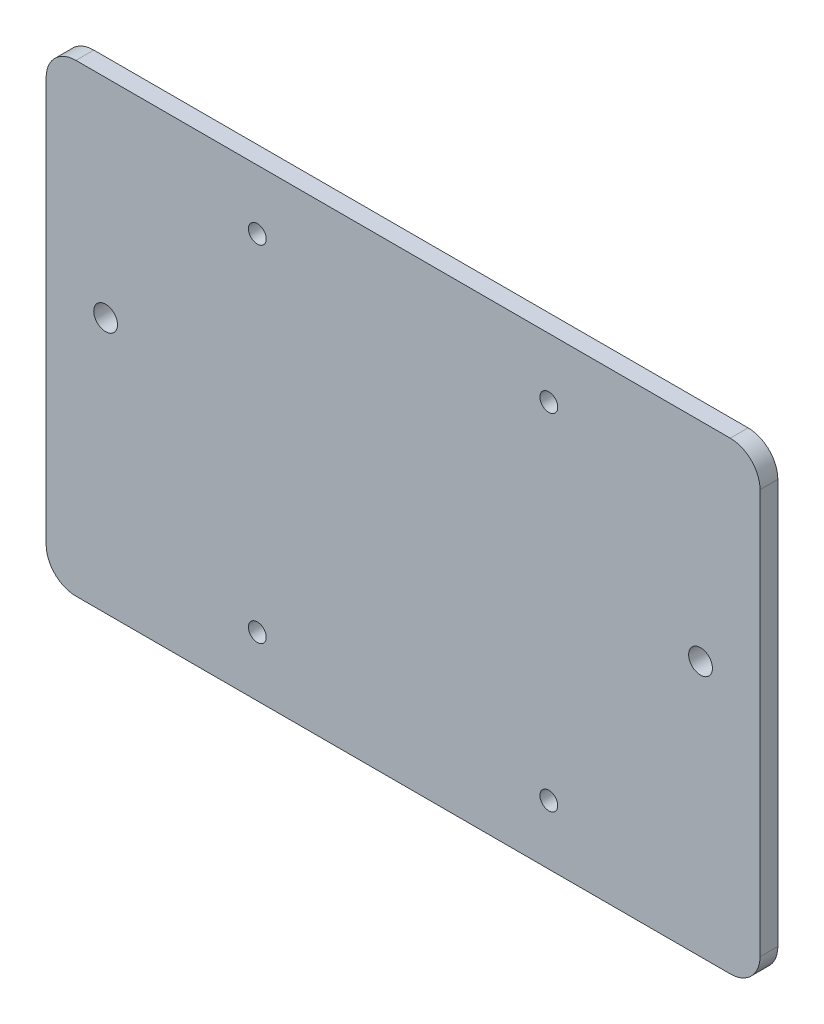
ISO-10303-21;
HEADER;
FILE_DESCRIPTION(('STEP AP214'),'2;1');
FILE_NAME('part.step','',(''),(''),'','','');
FILE_SCHEMA(('AUTOMOTIVE_DESIGN { 1 0 10303 214 1 1 1 1 }'));
ENDSEC;
DATA;
#1=APPLICATION_CONTEXT('core data for automotive mechanical design processes');
#2=APPLICATION_PROTOCOL_DEFINITION('international standard','automotive_design',2000,#1);
#3=PRODUCT_CONTEXT('',#1,'mechanical');
#4=PRODUCT('Part','Part','',(#3));
#5=PRODUCT_RELATED_PRODUCT_CATEGORY('part','',(#4));
#6=PRODUCT_DEFINITION_FORMATION('','',#4);
#7=PRODUCT_DEFINITION_CONTEXT('part definition',#1,'design');
#8=PRODUCT_DEFINITION('design','',#6,#7);
#9=PRODUCT_DEFINITION_SHAPE('','',#8);
#10=(LENGTH_UNIT() NAMED_UNIT(*) SI_UNIT(.MILLI.,.METRE.));
#11=(NAMED_UNIT(*) PLANE_ANGLE_UNIT() SI_UNIT($,.RADIAN.));
#12=(NAMED_UNIT(*) SI_UNIT($,.STERADIAN.) SOLID_ANGLE_UNIT());
#13=UNCERTAINTY_MEASURE_WITH_UNIT(LENGTH_MEASURE(1.E-05),#10,'distance_accuracy_value','');
#14=(GEOMETRIC_REPRESENTATION_CONTEXT(3) GLOBAL_UNCERTAINTY_ASSIGNED_CONTEXT((#13)) GLOBAL_UNIT_ASSIGNED_CONTEXT((#10,
#11,#12)) REPRESENTATION_CONTEXT('',''));
#15=CARTESIAN_POINT('',(0.,0.,0.));
#16=DIRECTION('',(0.,0.,1.));
#17=DIRECTION('',(1.,0.,0.));
#18=AXIS2_PLACEMENT_3D('',#15,#16,#17);
#19=CARTESIAN_POINT('',(55.,34.,3.));
#20=DIRECTION('',(0.,0.,-1.));
#21=DIRECTION('',(-1.,0.,0.));
#22=AXIS2_PLACEMENT_3D('',#19,#20,#21);
#23=PLANE('',#22);
#24=CARTESIAN_POINT('',(55.,34.,3.));
#25=DIRECTION('',(0.,0.,1.));
#26=DIRECTION('',(-1.,0.,0.));
#27=AXIS2_PLACEMENT_3D('',#24,#25,#26);
#28=CIRCLE('',#27,5.);
#29=CARTESIAN_POINT('',(60.,34.,3.));
#30=VERTEX_POINT('',#29);
#31=CARTESIAN_POINT('',(55.,39.,3.));
#32=VERTEX_POINT('',#31);
#33=EDGE_CURVE('E145',#30,#32,#28,.T.);
#34=ORIENTED_EDGE('',*,*,#33,.T.);
#35=DIRECTION('',(-1.,0.,0.));
#36=VECTOR('',#35,1.);
#37=CARTESIAN_POINT('',(-55.,39.,3.));
#38=LINE('',#37,#36);
#39=CARTESIAN_POINT('',(-55.,39.,3.));
#40=VERTEX_POINT('',#39);
#41=EDGE_CURVE('E93',#32,#40,#38,.T.);
#42=ORIENTED_EDGE('',*,*,#41,.T.);
#43=CARTESIAN_POINT('',(-55.,34.,3.));
#44=DIRECTION('',(0.,0.,1.));
#45=DIRECTION('',(1.,0.,0.));
#46=AXIS2_PLACEMENT_3D('',#43,#44,#45);
#47=CIRCLE('',#46,5.);
#48=CARTESIAN_POINT('',(-60.,34.,3.));
#49=VERTEX_POINT('',#48);
#50=EDGE_CURVE('E160',#40,#49,#47,.T.);
#51=ORIENTED_EDGE('',*,*,#50,.T.);
#52=DIRECTION('',(0.,-1.,0.));
#53=VECTOR('',#52,1.);
#54=CARTESIAN_POINT('',(-60.,34.,3.));
#55=LINE('',#54,#53);
#56=CARTESIAN_POINT('',(-60.,-34.,3.));
#57=VERTEX_POINT('',#56);
#58=EDGE_CURVE('E173',#49,#57,#55,.T.);
#59=ORIENTED_EDGE('',*,*,#58,.T.);
#60=CARTESIAN_POINT('',(-55.,-34.,3.));
#61=DIRECTION('',(0.,0.,1.));
#62=DIRECTION('',(1.,0.,0.));
#63=AXIS2_PLACEMENT_3D('',#60,#61,#62);
#64=CIRCLE('',#63,5.);
#65=CARTESIAN_POINT('',(-55.,-39.,3.));
#66=VERTEX_POINT('',#65);
#67=EDGE_CURVE('E112',#57,#66,#64,.T.);
#68=ORIENTED_EDGE('',*,*,#67,.T.);
#69=DIRECTION('',(1.,0.,0.));
#70=VECTOR('',#69,1.);
#71=CARTESIAN_POINT('',(-55.,-39.,3.));
#72=LINE('',#71,#70);
#73=CARTESIAN_POINT('',(55.,-39.,3.));
#74=VERTEX_POINT('',#73);
#75=EDGE_CURVE('E106',#66,#74,#72,.T.);
#76=ORIENTED_EDGE('',*,*,#75,.T.);
#77=CARTESIAN_POINT('',(55.,-34.,3.));
#78=DIRECTION('',(0.,0.,1.));
#79=DIRECTION('',(1.,0.,0.));
#80=AXIS2_PLACEMENT_3D('',#77,#78,#79);
#81=CIRCLE('',#80,5.);
#82=CARTESIAN_POINT('',(60.,-34.,3.));
#83=VERTEX_POINT('',#82);
#84=EDGE_CURVE('E110',#74,#83,#81,.T.);
#85=ORIENTED_EDGE('',*,*,#84,.T.);
#86=DIRECTION('',(0.,1.,0.));
#87=VECTOR('',#86,1.);
#88=CARTESIAN_POINT('',(60.,34.,3.));
#89=LINE('',#88,#87);
#90=EDGE_CURVE('E50',#83,#30,#89,.T.);
#91=ORIENTED_EDGE('',*,*,#90,.T.);
#92=EDGE_LOOP('',(#34,#42,#51,#59,#68,#76,#85,#91));
#93=FACE_BOUND('',#92,.T.);
#94=CARTESIAN_POINT('',(-24.5,29.,3.));
#95=DIRECTION('',(0.,0.,1.));
#96=DIRECTION('',(1.,0.,0.));
#97=AXIS2_PLACEMENT_3D('',#94,#95,#96);
#98=CIRCLE('',#97,1.5);
#99=CARTESIAN_POINT('',(-23.,29.,3.));
#100=VERTEX_POINT('',#99);
#101=EDGE_CURVE('E134',#100,#100,#98,.T.);
#102=ORIENTED_EDGE('',*,*,#101,.F.);
#103=EDGE_LOOP('',(#102));
#104=FACE_BOUND('',#103,.T.);
#105=CARTESIAN_POINT('',(24.5,29.,3.));
#106=DIRECTION('',(0.,0.,1.));
#107=DIRECTION('',(1.,0.,0.));
#108=AXIS2_PLACEMENT_3D('',#105,#106,#107);
#109=CIRCLE('',#108,1.5);
#110=CARTESIAN_POINT('',(26.,29.,3.));
#111=VERTEX_POINT('',#110);
#112=EDGE_CURVE('E182',#111,#111,#109,.T.);
#113=ORIENTED_EDGE('',*,*,#112,.F.);
#114=EDGE_LOOP('',(#113));
#115=FACE_BOUND('',#114,.T.);
#116=CARTESIAN_POINT('',(-24.5,-29.,3.));
#117=DIRECTION('',(0.,0.,1.));
#118=DIRECTION('',(1.,0.,0.));
#119=AXIS2_PLACEMENT_3D('',#116,#117,#118);
#120=CIRCLE('',#119,1.5);
#121=CARTESIAN_POINT('',(-23.,-29.,3.));
#122=VERTEX_POINT('',#121);
#123=EDGE_CURVE('E188',#122,#122,#120,.T.);
#124=ORIENTED_EDGE('',*,*,#123,.F.);
#125=EDGE_LOOP('',(#124));
#126=FACE_BOUND('',#125,.T.);
#127=CARTESIAN_POINT('',(24.5,-29.,3.));
#128=DIRECTION('',(0.,0.,1.));
#129=DIRECTION('',(1.,0.,0.));
#130=AXIS2_PLACEMENT_3D('',#127,#128,#129);
#131=CIRCLE('',#130,1.5);
#132=CARTESIAN_POINT('',(26.,-29.,3.));
#133=VERTEX_POINT('',#132);
#134=EDGE_CURVE('E194',#133,#133,#131,.T.);
#135=ORIENTED_EDGE('',*,*,#134,.F.);
#136=EDGE_LOOP('',(#135));
#137=FACE_BOUND('',#136,.T.);
#138=CARTESIAN_POINT('',(50.,4.00000000000002,3.));
#139=DIRECTION('',(0.,0.,1.));
#140=DIRECTION('',(1.,0.,0.));
#141=AXIS2_PLACEMENT_3D('',#138,#139,#140);
#142=CIRCLE('',#141,2.);
#143=CARTESIAN_POINT('',(52.,4.00000000000002,3.));
#144=VERTEX_POINT('',#143);
#145=EDGE_CURVE('E200',#144,#144,#142,.T.);
#146=ORIENTED_EDGE('',*,*,#145,.F.);
#147=EDGE_LOOP('',(#146));
#148=FACE_BOUND('',#147,.T.);
#149=CARTESIAN_POINT('',(-50.,4.,3.));
#150=DIRECTION('',(0.,0.,1.));
#151=DIRECTION('',(-1.,0.,0.));
#152=AXIS2_PLACEMENT_3D('',#149,#150,#151);
#153=CIRCLE('',#152,2.);
#154=CARTESIAN_POINT('',(-52.,4.,3.));
#155=VERTEX_POINT('',#154);
#156=EDGE_CURVE('E206',#155,#155,#153,.T.);
#157=ORIENTED_EDGE('',*,*,#156,.F.);
#158=EDGE_LOOP('',(#157));
#159=FACE_BOUND('',#158,.T.);
#160=ADVANCED_FACE('F33',(#93,#104,#115,#126,#137,#148,#159),#23,.F.);
#161=CARTESIAN_POINT('',(55.,34.,0.));
#162=DIRECTION('',(0.,0.,-1.));
#163=DIRECTION('',(-1.,0.,0.));
#164=AXIS2_PLACEMENT_3D('',#161,#162,#163);
#165=PLANE('',#164);
#166=CARTESIAN_POINT('',(50.,4.00000000000002,0.));
#167=DIRECTION('',(0.,0.,1.));
#168=DIRECTION('',(1.,0.,0.));
#169=AXIS2_PLACEMENT_3D('',#166,#167,#168);
#170=CIRCLE('',#169,2.);
#171=CARTESIAN_POINT('',(52.,4.00000000000002,0.));
#172=VERTEX_POINT('',#171);
#173=EDGE_CURVE('E203',#172,#172,#170,.T.);
#174=ORIENTED_EDGE('',*,*,#173,.T.);
#175=EDGE_LOOP('',(#174));
#176=FACE_BOUND('',#175,.T.);
#177=CARTESIAN_POINT('',(-24.5,-29.,0.));
#178=DIRECTION('',(0.,0.,1.));
#179=DIRECTION('',(1.,0.,0.));
#180=AXIS2_PLACEMENT_3D('',#177,#178,#179);
#181=CIRCLE('',#180,1.5);
#182=CARTESIAN_POINT('',(-23.,-29.,0.));
#183=VERTEX_POINT('',#182);
#184=EDGE_CURVE('E191',#183,#183,#181,.T.);
#185=ORIENTED_EDGE('',*,*,#184,.T.);
#186=EDGE_LOOP('',(#185));
#187=FACE_BOUND('',#186,.T.);
#188=CARTESIAN_POINT('',(-24.5,29.,0.));
#189=DIRECTION('',(0.,0.,1.));
#190=DIRECTION('',(1.,0.,0.));
#191=AXIS2_PLACEMENT_3D('',#188,#189,#190);
#192=CIRCLE('',#191,1.5);
#193=CARTESIAN_POINT('',(-23.,29.,0.));
#194=VERTEX_POINT('',#193);
#195=EDGE_CURVE('E179',#194,#194,#192,.T.);
#196=ORIENTED_EDGE('',*,*,#195,.T.);
#197=EDGE_LOOP('',(#196));
#198=FACE_BOUND('',#197,.T.);
#199=CARTESIAN_POINT('',(55.,34.,0.));
#200=DIRECTION('',(0.,0.,1.));
#201=DIRECTION('',(-1.,0.,0.));
#202=AXIS2_PLACEMENT_3D('',#199,#200,#201);
#203=CIRCLE('',#202,5.);
#204=CARTESIAN_POINT('',(60.,34.,0.));
#205=VERTEX_POINT('',#204);
#206=CARTESIAN_POINT('',(55.,39.,0.));
#207=VERTEX_POINT('',#206);
#208=EDGE_CURVE('E130',#205,#207,#203,.T.);
#209=ORIENTED_EDGE('',*,*,#208,.F.);
#210=DIRECTION('',(0.,1.,0.));
#211=VECTOR('',#210,1.);
#212=CARTESIAN_POINT('',(60.,34.,0.));
#213=LINE('',#212,#211);
#214=CARTESIAN_POINT('',(60.,-34.,0.));
#215=VERTEX_POINT('',#214);
#216=EDGE_CURVE('E85',#215,#205,#213,.T.);
#217=ORIENTED_EDGE('',*,*,#216,.F.);
#218=CARTESIAN_POINT('',(55.,-34.,0.));
#219=DIRECTION('',(0.,0.,1.));
#220=DIRECTION('',(1.,0.,0.));
#221=AXIS2_PLACEMENT_3D('',#218,#219,#220);
#222=CIRCLE('',#221,5.);
#223=CARTESIAN_POINT('',(55.,-39.,0.));
#224=VERTEX_POINT('',#223);
#225=EDGE_CURVE('E79',#224,#215,#222,.T.);
#226=ORIENTED_EDGE('',*,*,#225,.F.);
#227=DIRECTION('',(1.,0.,0.));
#228=VECTOR('',#227,1.);
#229=CARTESIAN_POINT('',(-55.,-39.,0.));
#230=LINE('',#229,#228);
#231=CARTESIAN_POINT('',(-55.,-39.,0.));
#232=VERTEX_POINT('',#231);
#233=EDGE_CURVE('E120',#232,#224,#230,.T.);
#234=ORIENTED_EDGE('',*,*,#233,.F.);
#235=CARTESIAN_POINT('',(-55.,-34.,0.));
#236=DIRECTION('',(0.,0.,1.));
#237=DIRECTION('',(1.,0.,0.));
#238=AXIS2_PLACEMENT_3D('',#235,#236,#237);
#239=CIRCLE('',#238,5.);
#240=CARTESIAN_POINT('',(-60.,-34.,0.));
#241=VERTEX_POINT('',#240);
#242=EDGE_CURVE('E140',#241,#232,#239,.T.);
#243=ORIENTED_EDGE('',*,*,#242,.F.);
#244=DIRECTION('',(0.,-1.,0.));
#245=VECTOR('',#244,1.);
#246=CARTESIAN_POINT('',(-60.,34.,0.));
#247=LINE('',#246,#245);
#248=CARTESIAN_POINT('',(-60.,34.,0.));
#249=VERTEX_POINT('',#248);
#250=EDGE_CURVE('E138',#249,#241,#247,.T.);
#251=ORIENTED_EDGE('',*,*,#250,.F.);
#252=CARTESIAN_POINT('',(-55.,34.,0.));
#253=DIRECTION('',(0.,0.,1.));
#254=DIRECTION('',(1.,0.,0.));
#255=AXIS2_PLACEMENT_3D('',#252,#253,#254);
#256=CIRCLE('',#255,5.);
#257=CARTESIAN_POINT('',(-55.,39.,0.));
#258=VERTEX_POINT('',#257);
#259=EDGE_CURVE('E136',#258,#249,#256,.T.);
#260=ORIENTED_EDGE('',*,*,#259,.F.);
#261=DIRECTION('',(-1.,0.,0.));
#262=VECTOR('',#261,1.);
#263=CARTESIAN_POINT('',(-55.,39.,0.));
#264=LINE('',#263,#262);
#265=EDGE_CURVE('E133',#207,#258,#264,.T.);
#266=ORIENTED_EDGE('',*,*,#265,.F.);
#267=EDGE_LOOP('',(#209,#217,#226,#234,#243,#251,#260,#266));
#268=FACE_BOUND('',#267,.T.);
#269=CARTESIAN_POINT('',(24.5,29.,0.));
#270=DIRECTION('',(0.,0.,1.));
#271=DIRECTION('',(1.,0.,0.));
#272=AXIS2_PLACEMENT_3D('',#269,#270,#271);
#273=CIRCLE('',#272,1.5);
#274=CARTESIAN_POINT('',(26.,29.,0.));
#275=VERTEX_POINT('',#274);
#276=EDGE_CURVE('E185',#275,#275,#273,.T.);
#277=ORIENTED_EDGE('',*,*,#276,.T.);
#278=EDGE_LOOP('',(#277));
#279=FACE_BOUND('',#278,.T.);
#280=CARTESIAN_POINT('',(24.5,-29.,0.));
#281=DIRECTION('',(0.,0.,1.));
#282=DIRECTION('',(1.,0.,0.));
#283=AXIS2_PLACEMENT_3D('',#280,#281,#282);
#284=CIRCLE('',#283,1.5);
#285=CARTESIAN_POINT('',(26.,-29.,0.));
#286=VERTEX_POINT('',#285);
#287=EDGE_CURVE('E197',#286,#286,#284,.T.);
#288=ORIENTED_EDGE('',*,*,#287,.T.);
#289=EDGE_LOOP('',(#288));
#290=FACE_BOUND('',#289,.T.);
#291=CARTESIAN_POINT('',(-50.,4.,0.));
#292=DIRECTION('',(0.,0.,1.));
#293=DIRECTION('',(-1.,0.,0.));
#294=AXIS2_PLACEMENT_3D('',#291,#292,#293);
#295=CIRCLE('',#294,2.);
#296=CARTESIAN_POINT('',(-52.,4.,0.));
#297=VERTEX_POINT('',#296);
#298=EDGE_CURVE('E209',#297,#297,#295,.T.);
#299=ORIENTED_EDGE('',*,*,#298,.T.);
#300=EDGE_LOOP('',(#299));
#301=FACE_BOUND('',#300,.T.);
#302=ADVANCED_FACE('F164',(#176,#187,#198,#268,#279,#290,#301),#165,.T.);
#303=CARTESIAN_POINT('',(55.,34.,3.));
#304=DIRECTION('',(0.,0.,-1.));
#305=DIRECTION('',(-1.,0.,0.));
#306=AXIS2_PLACEMENT_3D('',#303,#304,#305);
#307=CYLINDRICAL_SURFACE('',#306,5.);
#308=ORIENTED_EDGE('',*,*,#208,.T.);
#309=DIRECTION('',(0.,0.,-1.));
#310=VECTOR('',#309,1.);
#311=CARTESIAN_POINT('',(55.,39.,3.));
#312=LINE('',#311,#310);
#313=EDGE_CURVE('E11',#32,#207,#312,.T.);
#314=ORIENTED_EDGE('',*,*,#313,.F.);
#315=ORIENTED_EDGE('',*,*,#33,.F.);
#316=DIRECTION('',(0.,0.,-1.));
#317=VECTOR('',#316,1.);
#318=CARTESIAN_POINT('',(60.,34.,3.));
#319=LINE('',#318,#317);
#320=EDGE_CURVE('E126',#30,#205,#319,.T.);
#321=ORIENTED_EDGE('',*,*,#320,.T.);
#322=EDGE_LOOP('',(#308,#314,#315,#321));
#323=FACE_BOUND('',#322,.T.);
#324=ADVANCED_FACE('F35',(#323),#307,.T.);
#325=CARTESIAN_POINT('',(-55.,39.,3.));
#326=DIRECTION('',(0.,-1.,0.));
#327=DIRECTION('',(1.,0.,0.));
#328=AXIS2_PLACEMENT_3D('',#325,#326,#327);
#329=PLANE('',#328);
#330=ORIENTED_EDGE('',*,*,#265,.T.);
#331=DIRECTION('',(0.,0.,-1.));
#332=VECTOR('',#331,1.);
#333=CARTESIAN_POINT('',(-55.,39.,3.));
#334=LINE('',#333,#332);
#335=EDGE_CURVE('E42',#40,#258,#334,.T.);
#336=ORIENTED_EDGE('',*,*,#335,.F.);
#337=ORIENTED_EDGE('',*,*,#41,.F.);
#338=ORIENTED_EDGE('',*,*,#313,.T.);
#339=EDGE_LOOP('',(#330,#336,#337,#338));
#340=FACE_BOUND('',#339,.T.);
#341=ADVANCED_FACE('F241',(#340),#329,.F.);
#342=CARTESIAN_POINT('',(-55.,34.,3.));
#343=DIRECTION('',(0.,0.,-1.));
#344=DIRECTION('',(-1.,0.,0.));
#345=AXIS2_PLACEMENT_3D('',#342,#343,#344);
#346=CYLINDRICAL_SURFACE('',#345,5.);
#347=ORIENTED_EDGE('',*,*,#259,.T.);
#348=DIRECTION('',(0.,0.,-1.));
#349=VECTOR('',#348,1.);
#350=CARTESIAN_POINT('',(-60.,34.,3.));
#351=LINE('',#350,#349);
#352=EDGE_CURVE('E152',#49,#249,#351,.T.);
#353=ORIENTED_EDGE('',*,*,#352,.F.);
#354=ORIENTED_EDGE('',*,*,#50,.F.);
#355=ORIENTED_EDGE('',*,*,#335,.T.);
#356=EDGE_LOOP('',(#347,#353,#354,#355));
#357=FACE_BOUND('',#356,.T.);
#358=ADVANCED_FACE('F158',(#357),#346,.T.);
#359=CARTESIAN_POINT('',(-60.,34.,3.));
#360=DIRECTION('',(1.,0.,0.));
#361=DIRECTION('',(0.,1.,0.));
#362=AXIS2_PLACEMENT_3D('',#359,#360,#361);
#363=PLANE('',#362);
#364=ORIENTED_EDGE('',*,*,#250,.T.);
#365=DIRECTION('',(0.,0.,-1.));
#366=VECTOR('',#365,1.);
#367=CARTESIAN_POINT('',(-60.,-34.,3.));
#368=LINE('',#367,#366);
#369=EDGE_CURVE('E149',#57,#241,#368,.T.);
#370=ORIENTED_EDGE('',*,*,#369,.F.);
#371=ORIENTED_EDGE('',*,*,#58,.F.);
#372=ORIENTED_EDGE('',*,*,#352,.T.);
#373=EDGE_LOOP('',(#364,#370,#371,#372));
#374=FACE_BOUND('',#373,.T.);
#375=ADVANCED_FACE('F169',(#374),#363,.F.);
#376=CARTESIAN_POINT('',(-55.,-34.,3.));
#377=DIRECTION('',(0.,0.,-1.));
#378=DIRECTION('',(-1.,0.,0.));
#379=AXIS2_PLACEMENT_3D('',#376,#377,#378);
#380=CYLINDRICAL_SURFACE('',#379,5.);
#381=ORIENTED_EDGE('',*,*,#242,.T.);
#382=DIRECTION('',(0.,0.,-1.));
#383=VECTOR('',#382,1.);
#384=CARTESIAN_POINT('',(-55.,-39.,3.));
#385=LINE('',#384,#383);
#386=EDGE_CURVE('E121',#66,#232,#385,.T.);
#387=ORIENTED_EDGE('',*,*,#386,.F.);
#388=ORIENTED_EDGE('',*,*,#67,.F.);
#389=ORIENTED_EDGE('',*,*,#369,.T.);
#390=EDGE_LOOP('',(#381,#387,#388,#389));
#391=FACE_BOUND('',#390,.T.);
#392=ADVANCED_FACE('F172',(#391),#380,.T.);
#393=CARTESIAN_POINT('',(-55.,-39.,3.));
#394=DIRECTION('',(0.,1.,0.));
#395=DIRECTION('',(-1.,0.,0.));
#396=AXIS2_PLACEMENT_3D('',#393,#394,#395);
#397=PLANE('',#396);
#398=ORIENTED_EDGE('',*,*,#233,.T.);
#399=DIRECTION('',(0.,0.,-1.));
#400=VECTOR('',#399,1.);
#401=CARTESIAN_POINT('',(55.,-39.,3.));
#402=LINE('',#401,#400);
#403=EDGE_CURVE('E117',#74,#224,#402,.T.);
#404=ORIENTED_EDGE('',*,*,#403,.F.);
#405=ORIENTED_EDGE('',*,*,#75,.F.);
#406=ORIENTED_EDGE('',*,*,#386,.T.);
#407=EDGE_LOOP('',(#398,#404,#405,#406));
#408=FACE_BOUND('',#407,.T.);
#409=ADVANCED_FACE('F118',(#408),#397,.F.);
#410=CARTESIAN_POINT('',(55.,-34.,3.));
#411=DIRECTION('',(0.,0.,-1.));
#412=DIRECTION('',(-1.,0.,0.));
#413=AXIS2_PLACEMENT_3D('',#410,#411,#412);
#414=CYLINDRICAL_SURFACE('',#413,5.);
#415=ORIENTED_EDGE('',*,*,#225,.T.);
#416=DIRECTION('',(0.,0.,-1.));
#417=VECTOR('',#416,1.);
#418=CARTESIAN_POINT('',(60.,-34.,3.));
#419=LINE('',#418,#417);
#420=EDGE_CURVE('E122',#83,#215,#419,.T.);
#421=ORIENTED_EDGE('',*,*,#420,.F.);
#422=ORIENTED_EDGE('',*,*,#84,.F.);
#423=ORIENTED_EDGE('',*,*,#403,.T.);
#424=EDGE_LOOP('',(#415,#421,#422,#423));
#425=FACE_BOUND('',#424,.T.);
#426=ADVANCED_FACE('F124',(#425),#414,.T.);
#427=CARTESIAN_POINT('',(60.,34.,3.));
#428=DIRECTION('',(-1.,0.,0.));
#429=DIRECTION('',(0.,-1.,0.));
#430=AXIS2_PLACEMENT_3D('',#427,#428,#429);
#431=PLANE('',#430);
#432=ORIENTED_EDGE('',*,*,#216,.T.);
#433=ORIENTED_EDGE('',*,*,#320,.F.);
#434=ORIENTED_EDGE('',*,*,#90,.F.);
#435=ORIENTED_EDGE('',*,*,#420,.T.);
#436=EDGE_LOOP('',(#432,#433,#434,#435));
#437=FACE_BOUND('',#436,.T.);
#438=ADVANCED_FACE('F229',(#437),#431,.F.);
#439=CARTESIAN_POINT('',(-24.5,29.,3.));
#440=DIRECTION('',(0.,0.,-1.));
#441=DIRECTION('',(-1.,0.,0.));
#442=AXIS2_PLACEMENT_3D('',#439,#440,#441);
#443=CYLINDRICAL_SURFACE('',#442,1.5);
#444=ORIENTED_EDGE('',*,*,#101,.T.);
#445=EDGE_LOOP('',(#444));
#446=FACE_BOUND('',#445,.T.);
#447=ORIENTED_EDGE('',*,*,#195,.F.);
#448=EDGE_LOOP('',(#447));
#449=FACE_BOUND('',#448,.T.);
#450=ADVANCED_FACE('F226',(#446,#449),#443,.F.);
#451=CARTESIAN_POINT('',(24.5,29.,3.));
#452=DIRECTION('',(0.,0.,-1.));
#453=DIRECTION('',(-1.,0.,0.));
#454=AXIS2_PLACEMENT_3D('',#451,#452,#453);
#455=CYLINDRICAL_SURFACE('',#454,1.5);
#456=ORIENTED_EDGE('',*,*,#112,.T.);
#457=EDGE_LOOP('',(#456));
#458=FACE_BOUND('',#457,.T.);
#459=ORIENTED_EDGE('',*,*,#276,.F.);
#460=EDGE_LOOP('',(#459));
#461=FACE_BOUND('',#460,.T.);
#462=ADVANCED_FACE('F305',(#458,#461),#455,.F.);
#463=CARTESIAN_POINT('',(-24.5,-29.,3.));
#464=DIRECTION('',(0.,0.,-1.));
#465=DIRECTION('',(-1.,0.,0.));
#466=AXIS2_PLACEMENT_3D('',#463,#464,#465);
#467=CYLINDRICAL_SURFACE('',#466,1.5);
#468=ORIENTED_EDGE('',*,*,#123,.T.);
#469=EDGE_LOOP('',(#468));
#470=FACE_BOUND('',#469,.T.);
#471=ORIENTED_EDGE('',*,*,#184,.F.);
#472=EDGE_LOOP('',(#471));
#473=FACE_BOUND('',#472,.T.);
#474=ADVANCED_FACE('F313',(#470,#473),#467,.F.);
#475=CARTESIAN_POINT('',(24.5,-29.,3.));
#476=DIRECTION('',(0.,0.,-1.));
#477=DIRECTION('',(-1.,0.,0.));
#478=AXIS2_PLACEMENT_3D('',#475,#476,#477);
#479=CYLINDRICAL_SURFACE('',#478,1.5);
#480=ORIENTED_EDGE('',*,*,#134,.T.);
#481=EDGE_LOOP('',(#480));
#482=FACE_BOUND('',#481,.T.);
#483=ORIENTED_EDGE('',*,*,#287,.F.);
#484=EDGE_LOOP('',(#483));
#485=FACE_BOUND('',#484,.T.);
#486=ADVANCED_FACE('F321',(#482,#485),#479,.F.);
#487=CARTESIAN_POINT('',(50.,4.00000000000002,3.));
#488=DIRECTION('',(0.,0.,-1.));
#489=DIRECTION('',(-1.,0.,0.));
#490=AXIS2_PLACEMENT_3D('',#487,#488,#489);
#491=CYLINDRICAL_SURFACE('',#490,2.);
#492=ORIENTED_EDGE('',*,*,#145,.T.);
#493=EDGE_LOOP('',(#492));
#494=FACE_BOUND('',#493,.T.);
#495=ORIENTED_EDGE('',*,*,#173,.F.);
#496=EDGE_LOOP('',(#495));
#497=FACE_BOUND('',#496,.T.);
#498=ADVANCED_FACE('F330',(#494,#497),#491,.F.);
#499=CARTESIAN_POINT('',(-50.,4.,3.));
#500=DIRECTION('',(0.,0.,-1.));
#501=DIRECTION('',(-1.,0.,0.));
#502=AXIS2_PLACEMENT_3D('',#499,#500,#501);
#503=CYLINDRICAL_SURFACE('',#502,2.);
#504=ORIENTED_EDGE('',*,*,#156,.T.);
#505=EDGE_LOOP('',(#504));
#506=FACE_BOUND('',#505,.T.);
#507=ORIENTED_EDGE('',*,*,#298,.F.);
#508=EDGE_LOOP('',(#507));
#509=FACE_BOUND('',#508,.T.);
#510=ADVANCED_FACE('F215',(#506,#509),#503,.F.);
#511=CLOSED_SHELL('',(#160,#302,#324,#341,#358,#375,#392,#409,#426,#438,#450,#462,#474,#486,
#498,#510));
#512=MANIFOLD_SOLID_BREP('B2',#511);
#513=ADVANCED_BREP_SHAPE_REPRESENTATION('',(#18,#512),#14);
#514=SHAPE_DEFINITION_REPRESENTATION(#9,#513);
ENDSEC;
END-ISO-10303-21;
